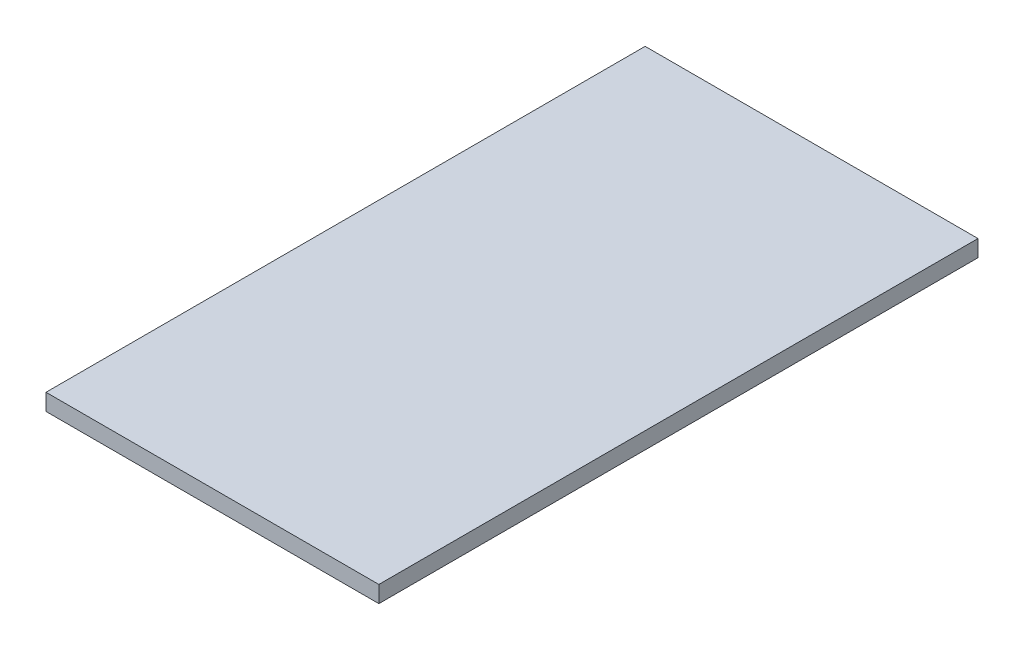
ISO-10303-21;
HEADER;
FILE_DESCRIPTION(('STEP AP214'),'2;1');
FILE_NAME('part.step','',(''),(''),'','','');
FILE_SCHEMA(('AUTOMOTIVE_DESIGN { 1 0 10303 214 1 1 1 1 }'));
ENDSEC;
DATA;
#1=APPLICATION_CONTEXT('core data for automotive mechanical design processes');
#2=APPLICATION_PROTOCOL_DEFINITION('international standard','automotive_design',2000,#1);
#3=PRODUCT_CONTEXT('',#1,'mechanical');
#4=PRODUCT('Part','Part','',(#3));
#5=PRODUCT_RELATED_PRODUCT_CATEGORY('part','',(#4));
#6=PRODUCT_DEFINITION_FORMATION('','',#4);
#7=PRODUCT_DEFINITION_CONTEXT('part definition',#1,'design');
#8=PRODUCT_DEFINITION('design','',#6,#7);
#9=PRODUCT_DEFINITION_SHAPE('','',#8);
#10=(LENGTH_UNIT() NAMED_UNIT(*) SI_UNIT(.MILLI.,.METRE.));
#11=(NAMED_UNIT(*) PLANE_ANGLE_UNIT() SI_UNIT($,.RADIAN.));
#12=(NAMED_UNIT(*) SI_UNIT($,.STERADIAN.) SOLID_ANGLE_UNIT());
#13=UNCERTAINTY_MEASURE_WITH_UNIT(LENGTH_MEASURE(1.E-05),#10,'distance_accuracy_value','');
#14=(GEOMETRIC_REPRESENTATION_CONTEXT(3) GLOBAL_UNCERTAINTY_ASSIGNED_CONTEXT((#13)) GLOBAL_UNIT_ASSIGNED_CONTEXT((#10,
#11,#12)) REPRESENTATION_CONTEXT('',''));
#15=CARTESIAN_POINT('',(0.,0.,0.));
#16=DIRECTION('',(0.,0.,1.));
#17=DIRECTION('',(1.,0.,0.));
#18=AXIS2_PLACEMENT_3D('',#15,#16,#17);
#19=CARTESIAN_POINT('',(0.,6.35,0.));
#20=DIRECTION('',(1.,0.,0.));
#21=DIRECTION('',(0.,0.,-1.));
#22=AXIS2_PLACEMENT_3D('',#19,#20,#21);
#23=PLANE('',#22);
#24=DIRECTION('',(0.,0.,1.));
#25=VECTOR('',#24,1.);
#26=CARTESIAN_POINT('',(0.,0.,0.));
#27=LINE('',#26,#25);
#28=CARTESIAN_POINT('',(0.,0.,-228.6));
#29=VERTEX_POINT('',#28);
#30=CARTESIAN_POINT('',(0.,0.,0.));
#31=VERTEX_POINT('',#30);
#32=EDGE_CURVE('E96',#29,#31,#27,.T.);
#33=ORIENTED_EDGE('',*,*,#32,.T.);
#34=DIRECTION('',(0.,-1.,0.));
#35=VECTOR('',#34,1.);
#36=CARTESIAN_POINT('',(0.,6.35,0.));
#37=LINE('',#36,#35);
#38=CARTESIAN_POINT('',(0.,6.35,0.));
#39=VERTEX_POINT('',#38);
#40=EDGE_CURVE('E11',#39,#31,#37,.T.);
#41=ORIENTED_EDGE('',*,*,#40,.F.);
#42=DIRECTION('',(0.,0.,1.));
#43=VECTOR('',#42,1.);
#44=CARTESIAN_POINT('',(0.,6.35,0.));
#45=LINE('',#44,#43);
#46=CARTESIAN_POINT('',(0.,6.35,-228.6));
#47=VERTEX_POINT('',#46);
#48=EDGE_CURVE('E84',#47,#39,#45,.T.);
#49=ORIENTED_EDGE('',*,*,#48,.F.);
#50=DIRECTION('',(0.,-1.,0.));
#51=VECTOR('',#50,1.);
#52=CARTESIAN_POINT('',(0.,6.35,-228.6));
#53=LINE('',#52,#51);
#54=EDGE_CURVE('E92',#47,#29,#53,.T.);
#55=ORIENTED_EDGE('',*,*,#54,.T.);
#56=EDGE_LOOP('',(#33,#41,#49,#55));
#57=FACE_BOUND('',#56,.T.);
#58=ADVANCED_FACE('F33',(#57),#23,.F.);
#59=CARTESIAN_POINT('',(0.,6.35,0.));
#60=DIRECTION('',(0.,0.,-1.));
#61=DIRECTION('',(-1.,0.,0.));
#62=AXIS2_PLACEMENT_3D('',#59,#60,#61);
#63=PLANE('',#62);
#64=DIRECTION('',(1.,0.,0.));
#65=VECTOR('',#64,1.);
#66=CARTESIAN_POINT('',(0.,0.,0.));
#67=LINE('',#66,#65);
#68=CARTESIAN_POINT('',(127.,0.,0.));
#69=VERTEX_POINT('',#68);
#70=EDGE_CURVE('E88',#31,#69,#67,.T.);
#71=ORIENTED_EDGE('',*,*,#70,.T.);
#72=DIRECTION('',(0.,-1.,0.));
#73=VECTOR('',#72,1.);
#74=CARTESIAN_POINT('',(127.,6.35,0.));
#75=LINE('',#74,#73);
#76=CARTESIAN_POINT('',(127.,6.35,0.));
#77=VERTEX_POINT('',#76);
#78=EDGE_CURVE('E41',#77,#69,#75,.T.);
#79=ORIENTED_EDGE('',*,*,#78,.F.);
#80=DIRECTION('',(1.,0.,0.));
#81=VECTOR('',#80,1.);
#82=CARTESIAN_POINT('',(0.,6.35,0.));
#83=LINE('',#82,#81);
#84=EDGE_CURVE('E79',#39,#77,#83,.T.);
#85=ORIENTED_EDGE('',*,*,#84,.F.);
#86=ORIENTED_EDGE('',*,*,#40,.T.);
#87=EDGE_LOOP('',(#71,#79,#85,#86));
#88=FACE_BOUND('',#87,.T.);
#89=ADVANCED_FACE('F87',(#88),#63,.F.);
#90=CARTESIAN_POINT('',(127.,6.35,0.));
#91=DIRECTION('',(-1.,0.,0.));
#92=DIRECTION('',(0.,0.,1.));
#93=AXIS2_PLACEMENT_3D('',#90,#91,#92);
#94=PLANE('',#93);
#95=DIRECTION('',(0.,0.,-1.));
#96=VECTOR('',#95,1.);
#97=CARTESIAN_POINT('',(127.,0.,0.));
#98=LINE('',#97,#96);
#99=CARTESIAN_POINT('',(127.,0.,-228.6));
#100=VERTEX_POINT('',#99);
#101=EDGE_CURVE('E66',#69,#100,#98,.T.);
#102=ORIENTED_EDGE('',*,*,#101,.T.);
#103=DIRECTION('',(0.,-1.,0.));
#104=VECTOR('',#103,1.);
#105=CARTESIAN_POINT('',(127.,6.35,-228.6));
#106=LINE('',#105,#104);
#107=CARTESIAN_POINT('',(127.,6.35,-228.6));
#108=VERTEX_POINT('',#107);
#109=EDGE_CURVE('E89',#108,#100,#106,.T.);
#110=ORIENTED_EDGE('',*,*,#109,.F.);
#111=DIRECTION('',(0.,0.,-1.));
#112=VECTOR('',#111,1.);
#113=CARTESIAN_POINT('',(127.,6.35,0.));
#114=LINE('',#113,#112);
#115=EDGE_CURVE('E82',#77,#108,#114,.T.);
#116=ORIENTED_EDGE('',*,*,#115,.F.);
#117=ORIENTED_EDGE('',*,*,#78,.T.);
#118=EDGE_LOOP('',(#102,#110,#116,#117));
#119=FACE_BOUND('',#118,.T.);
#120=ADVANCED_FACE('F90',(#119),#94,.F.);
#121=CARTESIAN_POINT('',(0.,6.35,-228.6));
#122=DIRECTION('',(0.,0.,1.));
#123=DIRECTION('',(1.,0.,0.));
#124=AXIS2_PLACEMENT_3D('',#121,#122,#123);
#125=PLANE('',#124);
#126=DIRECTION('',(-1.,0.,0.));
#127=VECTOR('',#126,1.);
#128=CARTESIAN_POINT('',(0.,0.,-228.6));
#129=LINE('',#128,#127);
#130=EDGE_CURVE('E72',#100,#29,#129,.T.);
#131=ORIENTED_EDGE('',*,*,#130,.T.);
#132=ORIENTED_EDGE('',*,*,#54,.F.);
#133=DIRECTION('',(-1.,0.,0.));
#134=VECTOR('',#133,1.);
#135=CARTESIAN_POINT('',(0.,6.35,-228.6));
#136=LINE('',#135,#134);
#137=EDGE_CURVE('E49',#108,#47,#136,.T.);
#138=ORIENTED_EDGE('',*,*,#137,.F.);
#139=ORIENTED_EDGE('',*,*,#109,.T.);
#140=EDGE_LOOP('',(#131,#132,#138,#139));
#141=FACE_BOUND('',#140,.T.);
#142=ADVANCED_FACE('F103',(#141),#125,.F.);
#143=CARTESIAN_POINT('',(0.,6.35,0.));
#144=DIRECTION('',(0.,-1.,0.));
#145=DIRECTION('',(0.,0.,-1.));
#146=AXIS2_PLACEMENT_3D('',#143,#144,#145);
#147=PLANE('',#146);
#148=ORIENTED_EDGE('',*,*,#48,.T.);
#149=ORIENTED_EDGE('',*,*,#84,.T.);
#150=ORIENTED_EDGE('',*,*,#115,.T.);
#151=ORIENTED_EDGE('',*,*,#137,.T.);
#152=EDGE_LOOP('',(#148,#149,#150,#151));
#153=FACE_BOUND('',#152,.T.);
#154=ADVANCED_FACE('F80',(#153),#147,.F.);
#155=CARTESIAN_POINT('',(0.,0.,0.));
#156=DIRECTION('',(0.,-1.,0.));
#157=DIRECTION('',(0.,0.,-1.));
#158=AXIS2_PLACEMENT_3D('',#155,#156,#157);
#159=PLANE('',#158);
#160=ORIENTED_EDGE('',*,*,#32,.F.);
#161=ORIENTED_EDGE('',*,*,#130,.F.);
#162=ORIENTED_EDGE('',*,*,#101,.F.);
#163=ORIENTED_EDGE('',*,*,#70,.F.);
#164=EDGE_LOOP('',(#160,#161,#162,#163));
#165=FACE_BOUND('',#164,.T.);
#166=ADVANCED_FACE('F106',(#165),#159,.T.);
#167=CLOSED_SHELL('',(#58,#89,#120,#142,#154,#166));
#168=MANIFOLD_SOLID_BREP('B2',#167);
#169=ADVANCED_BREP_SHAPE_REPRESENTATION('',(#18,#168),#14);
#170=SHAPE_DEFINITION_REPRESENTATION(#9,#169);
ENDSEC;
END-ISO-10303-21;
